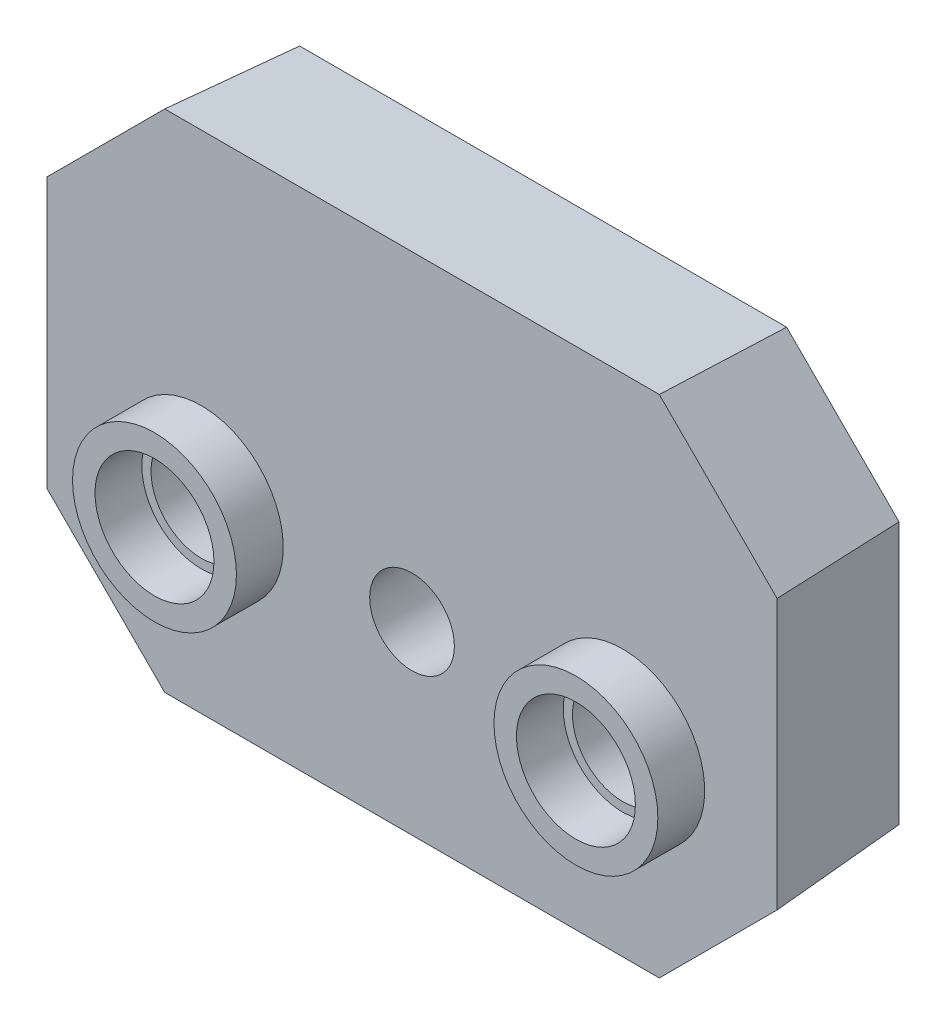
ISO-10303-21;
HEADER;
FILE_DESCRIPTION(('STEP AP214'),'2;1');
FILE_NAME('part.step','',(''),(''),'','','');
FILE_SCHEMA(('AUTOMOTIVE_DESIGN { 1 0 10303 214 1 1 1 1 }'));
ENDSEC;
DATA;
#1=APPLICATION_CONTEXT('core data for automotive mechanical design processes');
#2=APPLICATION_PROTOCOL_DEFINITION('international standard','automotive_design',2000,#1);
#3=PRODUCT_CONTEXT('',#1,'mechanical');
#4=PRODUCT('Part','Part','',(#3));
#5=PRODUCT_RELATED_PRODUCT_CATEGORY('part','',(#4));
#6=PRODUCT_DEFINITION_FORMATION('','',#4);
#7=PRODUCT_DEFINITION_CONTEXT('part definition',#1,'design');
#8=PRODUCT_DEFINITION('design','',#6,#7);
#9=PRODUCT_DEFINITION_SHAPE('','',#8);
#10=(LENGTH_UNIT() NAMED_UNIT(*) SI_UNIT(.MILLI.,.METRE.));
#11=(NAMED_UNIT(*) PLANE_ANGLE_UNIT() SI_UNIT($,.RADIAN.));
#12=(NAMED_UNIT(*) SI_UNIT($,.STERADIAN.) SOLID_ANGLE_UNIT());
#13=UNCERTAINTY_MEASURE_WITH_UNIT(LENGTH_MEASURE(1.E-05),#10,'distance_accuracy_value','');
#14=(GEOMETRIC_REPRESENTATION_CONTEXT(3) GLOBAL_UNCERTAINTY_ASSIGNED_CONTEXT((#13)) GLOBAL_UNIT_ASSIGNED_CONTEXT((#10,
#11,#12)) REPRESENTATION_CONTEXT('',''));
#15=CARTESIAN_POINT('',(0.,0.,0.));
#16=DIRECTION('',(0.,0.,1.));
#17=DIRECTION('',(1.,0.,0.));
#18=AXIS2_PLACEMENT_3D('',#15,#16,#17);
#19=CARTESIAN_POINT('',(0.,0.,28.));
#20=DIRECTION('',(0.,0.,-1.));
#21=DIRECTION('',(-1.,0.,0.));
#22=AXIS2_PLACEMENT_3D('',#19,#20,#21);
#23=PLANE('',#22);
#24=CARTESIAN_POINT('',(-45.,-14.5,28.));
#25=DIRECTION('',(0.,0.,-1.));
#26=DIRECTION('',(-1.,0.,0.));
#27=AXIS2_PLACEMENT_3D('',#24,#25,#26);
#28=CIRCLE('',#27,10.7420492655817);
#29=CARTESIAN_POINT('',(-55.7420492655817,-14.5,28.));
#30=VERTEX_POINT('',#29);
#31=EDGE_CURVE('E131',#30,#30,#28,.F.);
#32=ORIENTED_EDGE('',*,*,#31,.F.);
#33=EDGE_LOOP('',(#32));
#34=FACE_BOUND('',#33,.T.);
#35=CARTESIAN_POINT('',(-45.,-14.5,28.));
#36=DIRECTION('',(0.,0.,-1.));
#37=DIRECTION('',(-1.,0.,0.));
#38=AXIS2_PLACEMENT_3D('',#35,#36,#37);
#39=CIRCLE('',#38,12.7);
#40=CARTESIAN_POINT('',(-57.7,-14.5,28.));
#41=VERTEX_POINT('',#40);
#42=EDGE_CURVE('E244',#41,#41,#39,.F.);
#43=ORIENTED_EDGE('',*,*,#42,.T.);
#44=EDGE_LOOP('',(#43));
#45=FACE_BOUND('',#44,.T.);
#46=ADVANCED_FACE('F41',(#34,#45),#23,.F.);
#47=CARTESIAN_POINT('',(45.,-14.5,28.));
#48=DIRECTION('',(0.,0.,-1.));
#49=DIRECTION('',(-1.,0.,0.));
#50=AXIS2_PLACEMENT_3D('',#47,#48,#49);
#51=CIRCLE('',#50,10.7420492655817);
#52=CARTESIAN_POINT('',(34.2579507344183,-14.5,28.));
#53=VERTEX_POINT('',#52);
#54=EDGE_CURVE('E152',#53,#53,#51,.F.);
#55=ORIENTED_EDGE('',*,*,#54,.F.);
#56=EDGE_LOOP('',(#55));
#57=FACE_BOUND('',#56,.T.);
#58=CARTESIAN_POINT('',(45.,-14.5,28.));
#59=DIRECTION('',(0.,0.,-1.));
#60=DIRECTION('',(-1.,0.,0.));
#61=AXIS2_PLACEMENT_3D('',#58,#59,#60);
#62=CIRCLE('',#61,12.7);
#63=CARTESIAN_POINT('',(32.3,-14.5,28.));
#64=VERTEX_POINT('',#63);
#65=EDGE_CURVE('E375',#64,#64,#62,.F.);
#66=ORIENTED_EDGE('',*,*,#65,.T.);
#67=EDGE_LOOP('',(#66));
#68=FACE_BOUND('',#67,.T.);
#69=ADVANCED_FACE('F219',(#57,#68),#23,.F.);
#70=CARTESIAN_POINT('',(-45.,-14.5,28.));
#71=DIRECTION('',(0.,0.,-1.));
#72=DIRECTION('',(-1.,0.,0.));
#73=AXIS2_PLACEMENT_3D('',#70,#71,#72);
#74=CIRCLE('',#73,17.5);
#75=CARTESIAN_POINT('',(-62.5,-14.5,28.));
#76=VERTEX_POINT('',#75);
#77=EDGE_CURVE('E11',#76,#76,#74,.F.);
#78=ORIENTED_EDGE('',*,*,#77,.F.);
#79=EDGE_LOOP('',(#78));
#80=FACE_BOUND('',#79,.T.);
#81=CARTESIAN_POINT('',(45.,-14.5,28.));
#82=DIRECTION('',(0.,0.,-1.));
#83=DIRECTION('',(-1.,0.,0.));
#84=AXIS2_PLACEMENT_3D('',#81,#82,#83);
#85=CIRCLE('',#84,17.5);
#86=CARTESIAN_POINT('',(27.5,-14.5,28.));
#87=VERTEX_POINT('',#86);
#88=EDGE_CURVE('E49',#87,#87,#85,.F.);
#89=ORIENTED_EDGE('',*,*,#88,.F.);
#90=EDGE_LOOP('',(#89));
#91=FACE_BOUND('',#90,.T.);
#92=DIRECTION('',(0.707106781186548,0.707106781186548,0.));
#93=VECTOR('',#92,1.);
#94=CARTESIAN_POINT('',(-53.3844802415364,53.3844802415364,28.));
#95=LINE('',#94,#93);
#96=CARTESIAN_POINT('',(-52.8110097486544,53.9579507344183,28.));
#97=VERTEX_POINT('',#96);
#98=CARTESIAN_POINT('',(-77.9579507344183,28.8110097486544,28.));
#99=VERTEX_POINT('',#98);
#100=EDGE_CURVE('E148',#97,#99,#95,.F.);
#101=ORIENTED_EDGE('',*,*,#100,.T.);
#102=DIRECTION('',(0.,1.,0.));
#103=VECTOR('',#102,1.);
#104=CARTESIAN_POINT('',(-77.9579507344183,0.,28.));
#105=LINE('',#104,#103);
#106=CARTESIAN_POINT('',(-77.9579507344183,-28.8110097486544,28.));
#107=VERTEX_POINT('',#106);
#108=EDGE_CURVE('E121',#99,#107,#105,.F.);
#109=ORIENTED_EDGE('',*,*,#108,.T.);
#110=DIRECTION('',(-0.707106781186548,0.707106781186548,0.));
#111=VECTOR('',#110,1.);
#112=CARTESIAN_POINT('',(-53.3844802415364,-53.3844802415364,28.));
#113=LINE('',#112,#111);
#114=CARTESIAN_POINT('',(-52.8110097486544,-53.9579507344183,28.));
#115=VERTEX_POINT('',#114);
#116=EDGE_CURVE('E178',#107,#115,#113,.F.);
#117=ORIENTED_EDGE('',*,*,#116,.T.);
#118=DIRECTION('',(-1.,0.,0.));
#119=VECTOR('',#118,1.);
#120=CARTESIAN_POINT('',(0.,-53.9579507344183,28.));
#121=LINE('',#120,#119);
#122=CARTESIAN_POINT('',(52.8110097486544,-53.9579507344183,28.));
#123=VERTEX_POINT('',#122);
#124=EDGE_CURVE('E179',#115,#123,#121,.F.);
#125=ORIENTED_EDGE('',*,*,#124,.T.);
#126=DIRECTION('',(-0.707106781186548,-0.707106781186548,0.));
#127=VECTOR('',#126,1.);
#128=CARTESIAN_POINT('',(53.3844802415364,-53.3844802415364,28.));
#129=LINE('',#128,#127);
#130=CARTESIAN_POINT('',(77.9579507344183,-28.8110097486544,28.));
#131=VERTEX_POINT('',#130);
#132=EDGE_CURVE('E185',#123,#131,#129,.F.);
#133=ORIENTED_EDGE('',*,*,#132,.T.);
#134=DIRECTION('',(0.,-1.,0.));
#135=VECTOR('',#134,1.);
#136=CARTESIAN_POINT('',(77.9579507344183,0.,28.));
#137=LINE('',#136,#135);
#138=CARTESIAN_POINT('',(77.9579507344183,28.8110097486544,28.));
#139=VERTEX_POINT('',#138);
#140=EDGE_CURVE('E182',#131,#139,#137,.F.);
#141=ORIENTED_EDGE('',*,*,#140,.T.);
#142=DIRECTION('',(0.707106781186548,-0.707106781186548,0.));
#143=VECTOR('',#142,1.);
#144=CARTESIAN_POINT('',(53.3844802415364,53.3844802415364,28.));
#145=LINE('',#144,#143);
#146=CARTESIAN_POINT('',(52.8110097486544,53.9579507344183,28.));
#147=VERTEX_POINT('',#146);
#148=EDGE_CURVE('E65',#139,#147,#145,.F.);
#149=ORIENTED_EDGE('',*,*,#148,.T.);
#150=DIRECTION('',(1.,0.,0.));
#151=VECTOR('',#150,1.);
#152=CARTESIAN_POINT('',(0.,53.9579507344183,28.));
#153=LINE('',#152,#151);
#154=EDGE_CURVE('E44',#147,#97,#153,.F.);
#155=ORIENTED_EDGE('',*,*,#154,.T.);
#156=EDGE_LOOP('',(#101,#109,#117,#125,#133,#141,#149,#155));
#157=FACE_BOUND('',#156,.T.);
#158=CARTESIAN_POINT('',(0.,-14.5,28.));
#159=DIRECTION('',(0.,0.,-1.));
#160=DIRECTION('',(-1.,0.,0.));
#161=AXIS2_PLACEMENT_3D('',#158,#159,#160);
#162=CIRCLE('',#161,9.04204926558171);
#163=CARTESIAN_POINT('',(-9.04204926558171,-14.5,28.));
#164=VERTEX_POINT('',#163);
#165=EDGE_CURVE('E151',#164,#164,#162,.F.);
#166=ORIENTED_EDGE('',*,*,#165,.F.);
#167=EDGE_LOOP('',(#166));
#168=FACE_BOUND('',#167,.T.);
#169=ADVANCED_FACE('F190',(#80,#91,#157,#168),#23,.F.);
#170=CARTESIAN_POINT('',(0.,0.,0.));
#171=DIRECTION('',(0.,0.,-1.));
#172=DIRECTION('',(-1.,0.,0.));
#173=AXIS2_PLACEMENT_3D('',#170,#171,#172);
#174=PLANE('',#173);
#175=CARTESIAN_POINT('',(45.,-14.5,0.));
#176=DIRECTION('',(0.,0.,1.));
#177=DIRECTION('',(1.,0.,0.));
#178=AXIS2_PLACEMENT_3D('',#175,#176,#177);
#179=CIRCLE('',#178,12.7);
#180=CARTESIAN_POINT('',(57.7,-14.5,0.));
#181=VERTEX_POINT('',#180);
#182=EDGE_CURVE('E154',#181,#181,#179,.T.);
#183=ORIENTED_EDGE('',*,*,#182,.T.);
#184=EDGE_LOOP('',(#183));
#185=FACE_BOUND('',#184,.T.);
#186=DIRECTION('',(-0.707106781186548,-0.707106781186547,0.));
#187=VECTOR('',#186,1.);
#188=CARTESIAN_POINT('',(-76.,28.,0.));
#189=LINE('',#188,#187);
#190=CARTESIAN_POINT('',(-52.,52.,0.));
#191=VERTEX_POINT('',#190);
#192=CARTESIAN_POINT('',(-76.,28.,0.));
#193=VERTEX_POINT('',#192);
#194=EDGE_CURVE('E111',#191,#193,#189,.T.);
#195=ORIENTED_EDGE('',*,*,#194,.F.);
#196=DIRECTION('',(-1.,0.,0.));
#197=VECTOR('',#196,1.);
#198=CARTESIAN_POINT('',(-52.,52.,0.));
#199=LINE('',#198,#197);
#200=CARTESIAN_POINT('',(52.,52.,0.));
#201=VERTEX_POINT('',#200);
#202=EDGE_CURVE('E149',#201,#191,#199,.T.);
#203=ORIENTED_EDGE('',*,*,#202,.F.);
#204=DIRECTION('',(-0.707106781186548,0.707106781186547,0.));
#205=VECTOR('',#204,1.);
#206=CARTESIAN_POINT('',(52.,52.,0.));
#207=LINE('',#206,#205);
#208=CARTESIAN_POINT('',(76.,28.,0.));
#209=VERTEX_POINT('',#208);
#210=EDGE_CURVE('E147',#209,#201,#207,.T.);
#211=ORIENTED_EDGE('',*,*,#210,.F.);
#212=DIRECTION('',(0.,1.,0.));
#213=VECTOR('',#212,1.);
#214=CARTESIAN_POINT('',(76.,28.,0.));
#215=LINE('',#214,#213);
#216=CARTESIAN_POINT('',(76.,-28.,0.));
#217=VERTEX_POINT('',#216);
#218=EDGE_CURVE('E143',#217,#209,#215,.T.);
#219=ORIENTED_EDGE('',*,*,#218,.F.);
#220=DIRECTION('',(0.707106781186548,0.707106781186547,0.));
#221=VECTOR('',#220,1.);
#222=CARTESIAN_POINT('',(76.,-28.,0.));
#223=LINE('',#222,#221);
#224=CARTESIAN_POINT('',(52.,-52.,0.));
#225=VERTEX_POINT('',#224);
#226=EDGE_CURVE('E145',#225,#217,#223,.T.);
#227=ORIENTED_EDGE('',*,*,#226,.F.);
#228=DIRECTION('',(1.,0.,0.));
#229=VECTOR('',#228,1.);
#230=CARTESIAN_POINT('',(52.,-52.,0.));
#231=LINE('',#230,#229);
#232=CARTESIAN_POINT('',(-52.,-52.,0.));
#233=VERTEX_POINT('',#232);
#234=EDGE_CURVE('E139',#233,#225,#231,.T.);
#235=ORIENTED_EDGE('',*,*,#234,.F.);
#236=DIRECTION('',(0.707106781186548,-0.707106781186547,0.));
#237=VECTOR('',#236,1.);
#238=CARTESIAN_POINT('',(-52.,-52.,0.));
#239=LINE('',#238,#237);
#240=CARTESIAN_POINT('',(-76.,-28.,0.));
#241=VERTEX_POINT('',#240);
#242=EDGE_CURVE('E113',#241,#233,#239,.T.);
#243=ORIENTED_EDGE('',*,*,#242,.F.);
#244=DIRECTION('',(0.,-1.,0.));
#245=VECTOR('',#244,1.);
#246=CARTESIAN_POINT('',(-76.,-28.,0.));
#247=LINE('',#246,#245);
#248=EDGE_CURVE('E110',#193,#241,#247,.T.);
#249=ORIENTED_EDGE('',*,*,#248,.F.);
#250=EDGE_LOOP('',(#195,#203,#211,#219,#227,#235,#243,#249));
#251=FACE_BOUND('',#250,.T.);
#252=CARTESIAN_POINT('',(0.,-14.5,0.));
#253=DIRECTION('',(0.,0.,1.));
#254=DIRECTION('',(1.,0.,0.));
#255=AXIS2_PLACEMENT_3D('',#252,#253,#254);
#256=CIRCLE('',#255,11.);
#257=CARTESIAN_POINT('',(11.,-14.5,0.));
#258=VERTEX_POINT('',#257);
#259=EDGE_CURVE('E160',#258,#258,#256,.T.);
#260=ORIENTED_EDGE('',*,*,#259,.T.);
#261=EDGE_LOOP('',(#260));
#262=FACE_BOUND('',#261,.T.);
#263=CARTESIAN_POINT('',(-45.,-14.5,0.));
#264=DIRECTION('',(0.,0.,1.));
#265=DIRECTION('',(1.,0.,0.));
#266=AXIS2_PLACEMENT_3D('',#263,#264,#265);
#267=CIRCLE('',#266,12.7);
#268=CARTESIAN_POINT('',(-32.3,-14.5,0.));
#269=VERTEX_POINT('',#268);
#270=EDGE_CURVE('E132',#269,#269,#267,.T.);
#271=ORIENTED_EDGE('',*,*,#270,.T.);
#272=EDGE_LOOP('',(#271));
#273=FACE_BOUND('',#272,.T.);
#274=ADVANCED_FACE('F109',(#185,#251,#262,#273),#174,.T.);
#275=CARTESIAN_POINT('',(-76.,28.,0.));
#276=DIRECTION('',(-0.70538430460664,0.70538430460664,-0.0697564737441253));
#277=DIRECTION('',(0.0493252756161324,-0.0493252756161324,-0.997564050259824));
#278=AXIS2_PLACEMENT_3D('',#275,#276,#277);
#279=PLANE('',#278);
#280=ORIENTED_EDGE('',*,*,#194,.T.);
#281=DIRECTION('',(0.0697273732502733,-0.0288820236689142,-0.997147893809341));
#282=VECTOR('',#281,1.);
#283=CARTESIAN_POINT('',(-75.8872234119032,27.9532864076921,-1.61278034794292));
#284=LINE('',#283,#282);
#285=EDGE_CURVE('E123',#99,#193,#284,.T.);
#286=ORIENTED_EDGE('',*,*,#285,.F.);
#287=ORIENTED_EDGE('',*,*,#100,.F.);
#288=DIRECTION('',(0.0288820236689141,-0.0697273732502733,-0.997147893809341));
#289=VECTOR('',#288,1.);
#290=CARTESIAN_POINT('',(-51.971687287519,51.9316470655409,-0.977492503367005));
#291=LINE('',#290,#289);
#292=EDGE_CURVE('E127',#97,#191,#291,.T.);
#293=ORIENTED_EDGE('',*,*,#292,.T.);
#294=EDGE_LOOP('',(#280,#286,#287,#293));
#295=FACE_BOUND('',#294,.T.);
#296=ADVANCED_FACE('F129',(#295),#279,.T.);
#297=CARTESIAN_POINT('',(-76.,-28.,0.));
#298=DIRECTION('',(-0.997564050259824,0.,-0.0697564737441253));
#299=DIRECTION('',(0.0697564737441253,0.,-0.997564050259824));
#300=AXIS2_PLACEMENT_3D('',#297,#298,#299);
#301=PLANE('',#300);
#302=ORIENTED_EDGE('',*,*,#248,.T.);
#303=DIRECTION('',(0.0697273732502733,0.0288820236689142,-0.997147893809341));
#304=VECTOR('',#303,1.);
#305=CARTESIAN_POINT('',(-75.9316470655409,-27.971687287519,-0.977492503367005));
#306=LINE('',#305,#304);
#307=EDGE_CURVE('E128',#107,#241,#306,.T.);
#308=ORIENTED_EDGE('',*,*,#307,.F.);
#309=ORIENTED_EDGE('',*,*,#108,.F.);
#310=ORIENTED_EDGE('',*,*,#285,.T.);
#311=EDGE_LOOP('',(#302,#308,#309,#310));
#312=FACE_BOUND('',#311,.T.);
#313=ADVANCED_FACE('F122',(#312),#301,.T.);
#314=CARTESIAN_POINT('',(-52.,-52.,0.));
#315=DIRECTION('',(-0.70538430460664,-0.70538430460664,-0.0697564737441253));
#316=DIRECTION('',(0.0493252756161324,0.0493252756161324,-0.997564050259824));
#317=AXIS2_PLACEMENT_3D('',#314,#315,#316);
#318=PLANE('',#317);
#319=ORIENTED_EDGE('',*,*,#242,.T.);
#320=DIRECTION('',(0.0288820236689142,0.0697273732502733,-0.997147893809341));
#321=VECTOR('',#320,1.);
#322=CARTESIAN_POINT('',(-51.913246185714,-51.7905577649631,-2.99516350332257));
#323=LINE('',#322,#321);
#324=EDGE_CURVE('E175',#115,#233,#323,.T.);
#325=ORIENTED_EDGE('',*,*,#324,.F.);
#326=ORIENTED_EDGE('',*,*,#116,.F.);
#327=ORIENTED_EDGE('',*,*,#307,.T.);
#328=EDGE_LOOP('',(#319,#325,#326,#327));
#329=FACE_BOUND('',#328,.T.);
#330=ADVANCED_FACE('F205',(#329),#318,.T.);
#331=CARTESIAN_POINT('',(52.,-52.,0.));
#332=DIRECTION('',(0.,-0.997564050259824,-0.0697564737441253));
#333=DIRECTION('',(0.,0.0697564737441253,-0.997564050259824));
#334=AXIS2_PLACEMENT_3D('',#331,#332,#333);
#335=PLANE('',#334);
#336=ORIENTED_EDGE('',*,*,#234,.T.);
#337=DIRECTION('',(-0.0288820236689141,0.0697273732502733,-0.997147893809341));
#338=VECTOR('',#337,1.);
#339=CARTESIAN_POINT('',(51.971687287519,-51.9316470655409,-0.977492503367005));
#340=LINE('',#339,#338);
#341=EDGE_CURVE('E170',#123,#225,#340,.T.);
#342=ORIENTED_EDGE('',*,*,#341,.F.);
#343=ORIENTED_EDGE('',*,*,#124,.F.);
#344=ORIENTED_EDGE('',*,*,#324,.T.);
#345=EDGE_LOOP('',(#336,#342,#343,#344));
#346=FACE_BOUND('',#345,.T.);
#347=ADVANCED_FACE('F207',(#346),#335,.T.);
#348=CARTESIAN_POINT('',(76.,-28.,0.));
#349=DIRECTION('',(0.70538430460664,-0.70538430460664,-0.0697564737441253));
#350=DIRECTION('',(-0.0493252756161324,0.0493252756161324,-0.997564050259824));
#351=AXIS2_PLACEMENT_3D('',#348,#349,#350);
#352=PLANE('',#351);
#353=ORIENTED_EDGE('',*,*,#226,.T.);
#354=DIRECTION('',(-0.0697273732502733,0.0288820236689142,-0.997147893809341));
#355=VECTOR('',#354,1.);
#356=CARTESIAN_POINT('',(75.8872234119032,-27.9532864076921,-1.61278034794292));
#357=LINE('',#356,#355);
#358=EDGE_CURVE('E168',#131,#217,#357,.T.);
#359=ORIENTED_EDGE('',*,*,#358,.F.);
#360=ORIENTED_EDGE('',*,*,#132,.F.);
#361=ORIENTED_EDGE('',*,*,#341,.T.);
#362=EDGE_LOOP('',(#353,#359,#360,#361));
#363=FACE_BOUND('',#362,.T.);
#364=ADVANCED_FACE('F209',(#363),#352,.T.);
#365=CARTESIAN_POINT('',(76.,28.,0.));
#366=DIRECTION('',(0.997564050259824,0.,-0.0697564737441253));
#367=DIRECTION('',(-0.0697564737441253,0.,-0.997564050259824));
#368=AXIS2_PLACEMENT_3D('',#365,#366,#367);
#369=PLANE('',#368);
#370=ORIENTED_EDGE('',*,*,#218,.T.);
#371=DIRECTION('',(-0.0697273732502733,-0.0288820236689142,-0.997147893809341));
#372=VECTOR('',#371,1.);
#373=CARTESIAN_POINT('',(75.9316470655409,27.971687287519,-0.977492503367005));
#374=LINE('',#373,#372);
#375=EDGE_CURVE('E163',#139,#209,#374,.T.);
#376=ORIENTED_EDGE('',*,*,#375,.F.);
#377=ORIENTED_EDGE('',*,*,#140,.F.);
#378=ORIENTED_EDGE('',*,*,#358,.T.);
#379=EDGE_LOOP('',(#370,#376,#377,#378));
#380=FACE_BOUND('',#379,.T.);
#381=ADVANCED_FACE('F195',(#380),#369,.T.);
#382=CARTESIAN_POINT('',(52.,52.,0.));
#383=DIRECTION('',(0.70538430460664,0.70538430460664,-0.0697564737441253));
#384=DIRECTION('',(-0.0493252756161324,-0.0493252756161324,-0.997564050259824));
#385=AXIS2_PLACEMENT_3D('',#382,#383,#384);
#386=PLANE('',#385);
#387=ORIENTED_EDGE('',*,*,#210,.T.);
#388=DIRECTION('',(-0.0288820236689142,-0.0697273732502733,-0.997147893809341));
#389=VECTOR('',#388,1.);
#390=CARTESIAN_POINT('',(51.913246185714,51.7905577649631,-2.99516350332257));
#391=LINE('',#390,#389);
#392=EDGE_CURVE('E158',#147,#201,#391,.T.);
#393=ORIENTED_EDGE('',*,*,#392,.F.);
#394=ORIENTED_EDGE('',*,*,#148,.F.);
#395=ORIENTED_EDGE('',*,*,#375,.T.);
#396=EDGE_LOOP('',(#387,#393,#394,#395));
#397=FACE_BOUND('',#396,.T.);
#398=ADVANCED_FACE('F197',(#397),#386,.T.);
#399=CARTESIAN_POINT('',(-52.,52.,0.));
#400=DIRECTION('',(0.,0.997564050259824,-0.0697564737441253));
#401=DIRECTION('',(0.,-0.0697564737441253,-0.997564050259824));
#402=AXIS2_PLACEMENT_3D('',#399,#400,#401);
#403=PLANE('',#402);
#404=ORIENTED_EDGE('',*,*,#202,.T.);
#405=ORIENTED_EDGE('',*,*,#292,.F.);
#406=ORIENTED_EDGE('',*,*,#154,.F.);
#407=ORIENTED_EDGE('',*,*,#392,.T.);
#408=EDGE_LOOP('',(#404,#405,#406,#407));
#409=FACE_BOUND('',#408,.T.);
#410=ADVANCED_FACE('F198',(#409),#403,.T.);
#411=CARTESIAN_POINT('',(-45.,-14.5,0.));
#412=DIRECTION('',(0.,0.,-1.));
#413=DIRECTION('',(1.,0.,0.));
#414=AXIS2_PLACEMENT_3D('',#411,#412,#413);
#415=CONICAL_SURFACE('',#414,12.7,0.0698131700797732);
#416=ORIENTED_EDGE('',*,*,#31,.T.);
#417=EDGE_LOOP('',(#416));
#418=FACE_BOUND('',#417,.T.);
#419=ORIENTED_EDGE('',*,*,#270,.F.);
#420=EDGE_LOOP('',(#419));
#421=FACE_BOUND('',#420,.T.);
#422=ADVANCED_FACE('F253',(#418,#421),#415,.F.);
#423=CARTESIAN_POINT('',(45.,-14.5,0.));
#424=DIRECTION('',(0.,0.,-1.));
#425=DIRECTION('',(1.,0.,0.));
#426=AXIS2_PLACEMENT_3D('',#423,#424,#425);
#427=CONICAL_SURFACE('',#426,12.7,0.0698131700797732);
#428=ORIENTED_EDGE('',*,*,#54,.T.);
#429=EDGE_LOOP('',(#428));
#430=FACE_BOUND('',#429,.T.);
#431=ORIENTED_EDGE('',*,*,#182,.F.);
#432=EDGE_LOOP('',(#431));
#433=FACE_BOUND('',#432,.T.);
#434=ADVANCED_FACE('F252',(#430,#433),#427,.F.);
#435=CARTESIAN_POINT('',(0.,-14.5,0.));
#436=DIRECTION('',(0.,0.,-1.));
#437=DIRECTION('',(1.,0.,0.));
#438=AXIS2_PLACEMENT_3D('',#435,#436,#437);
#439=CONICAL_SURFACE('',#438,11.,0.0698131700797732);
#440=ORIENTED_EDGE('',*,*,#165,.T.);
#441=EDGE_LOOP('',(#440));
#442=FACE_BOUND('',#441,.T.);
#443=ORIENTED_EDGE('',*,*,#259,.F.);
#444=EDGE_LOOP('',(#443));
#445=FACE_BOUND('',#444,.T.);
#446=ADVANCED_FACE('F43',(#442,#445),#439,.F.);
#447=CARTESIAN_POINT('',(45.,-14.5,38.));
#448=DIRECTION('',(0.,0.,-1.));
#449=DIRECTION('',(-1.,0.,0.));
#450=AXIS2_PLACEMENT_3D('',#447,#448,#449);
#451=CYLINDRICAL_SURFACE('',#450,17.5);
#452=CARTESIAN_POINT('',(45.,-14.5,38.));
#453=DIRECTION('',(0.,0.,1.));
#454=DIRECTION('',(1.,0.,0.));
#455=AXIS2_PLACEMENT_3D('',#452,#453,#454);
#456=CIRCLE('',#455,17.5);
#457=CARTESIAN_POINT('',(62.5,-14.5,38.));
#458=VERTEX_POINT('',#457);
#459=EDGE_CURVE('E373',#458,#458,#456,.T.);
#460=ORIENTED_EDGE('',*,*,#459,.F.);
#461=EDGE_LOOP('',(#460));
#462=FACE_BOUND('',#461,.T.);
#463=ORIENTED_EDGE('',*,*,#88,.T.);
#464=EDGE_LOOP('',(#463));
#465=FACE_BOUND('',#464,.T.);
#466=ADVANCED_FACE('F260',(#462,#465),#451,.T.);
#467=CARTESIAN_POINT('',(45.,-14.5,38.));
#468=DIRECTION('',(0.,0.,-1.));
#469=DIRECTION('',(-1.,0.,0.));
#470=AXIS2_PLACEMENT_3D('',#467,#468,#469);
#471=CYLINDRICAL_SURFACE('',#470,12.7);
#472=CARTESIAN_POINT('',(45.,-14.5,38.));
#473=DIRECTION('',(0.,0.,1.));
#474=DIRECTION('',(1.,0.,0.));
#475=AXIS2_PLACEMENT_3D('',#472,#473,#474);
#476=CIRCLE('',#475,12.7);
#477=CARTESIAN_POINT('',(57.7,-14.5,38.));
#478=VERTEX_POINT('',#477);
#479=EDGE_CURVE('E369',#478,#478,#476,.T.);
#480=ORIENTED_EDGE('',*,*,#479,.T.);
#481=EDGE_LOOP('',(#480));
#482=FACE_BOUND('',#481,.T.);
#483=ORIENTED_EDGE('',*,*,#65,.F.);
#484=EDGE_LOOP('',(#483));
#485=FACE_BOUND('',#484,.T.);
#486=ADVANCED_FACE('F311',(#482,#485),#471,.F.);
#487=CARTESIAN_POINT('',(45.,-14.5,38.));
#488=DIRECTION('',(0.,0.,1.));
#489=DIRECTION('',(1.,0.,0.));
#490=AXIS2_PLACEMENT_3D('',#487,#488,#489);
#491=PLANE('',#490);
#492=ORIENTED_EDGE('',*,*,#459,.T.);
#493=EDGE_LOOP('',(#492));
#494=FACE_BOUND('',#493,.T.);
#495=ORIENTED_EDGE('',*,*,#479,.F.);
#496=EDGE_LOOP('',(#495));
#497=FACE_BOUND('',#496,.T.);
#498=ADVANCED_FACE('F321',(#494,#497),#491,.T.);
#499=CARTESIAN_POINT('',(-45.,-14.5,38.));
#500=DIRECTION('',(0.,0.,-1.));
#501=DIRECTION('',(-1.,0.,0.));
#502=AXIS2_PLACEMENT_3D('',#499,#500,#501);
#503=CYLINDRICAL_SURFACE('',#502,17.5);
#504=CARTESIAN_POINT('',(-45.,-14.5,38.));
#505=DIRECTION('',(0.,0.,1.));
#506=DIRECTION('',(1.,0.,0.));
#507=AXIS2_PLACEMENT_3D('',#504,#505,#506);
#508=CIRCLE('',#507,17.5);
#509=CARTESIAN_POINT('',(-27.5,-14.5,38.));
#510=VERTEX_POINT('',#509);
#511=EDGE_CURVE('E366',#510,#510,#508,.T.);
#512=ORIENTED_EDGE('',*,*,#511,.F.);
#513=EDGE_LOOP('',(#512));
#514=FACE_BOUND('',#513,.T.);
#515=ORIENTED_EDGE('',*,*,#77,.T.);
#516=EDGE_LOOP('',(#515));
#517=FACE_BOUND('',#516,.T.);
#518=ADVANCED_FACE('F328',(#514,#517),#503,.T.);
#519=CARTESIAN_POINT('',(-45.,-14.5,38.));
#520=DIRECTION('',(0.,0.,-1.));
#521=DIRECTION('',(-1.,0.,0.));
#522=AXIS2_PLACEMENT_3D('',#519,#520,#521);
#523=CYLINDRICAL_SURFACE('',#522,12.7);
#524=CARTESIAN_POINT('',(-45.,-14.5,38.));
#525=DIRECTION('',(0.,0.,1.));
#526=DIRECTION('',(1.,0.,0.));
#527=AXIS2_PLACEMENT_3D('',#524,#525,#526);
#528=CIRCLE('',#527,12.7);
#529=CARTESIAN_POINT('',(-32.3,-14.5,38.));
#530=VERTEX_POINT('',#529);
#531=EDGE_CURVE('E368',#530,#530,#528,.T.);
#532=ORIENTED_EDGE('',*,*,#531,.T.);
#533=EDGE_LOOP('',(#532));
#534=FACE_BOUND('',#533,.T.);
#535=ORIENTED_EDGE('',*,*,#42,.F.);
#536=EDGE_LOOP('',(#535));
#537=FACE_BOUND('',#536,.T.);
#538=ADVANCED_FACE('F338',(#534,#537),#523,.F.);
#539=CARTESIAN_POINT('',(-45.,-14.5,38.));
#540=DIRECTION('',(0.,0.,1.));
#541=DIRECTION('',(1.,0.,0.));
#542=AXIS2_PLACEMENT_3D('',#539,#540,#541);
#543=PLANE('',#542);
#544=ORIENTED_EDGE('',*,*,#511,.T.);
#545=EDGE_LOOP('',(#544));
#546=FACE_BOUND('',#545,.T.);
#547=ORIENTED_EDGE('',*,*,#531,.F.);
#548=EDGE_LOOP('',(#547));
#549=FACE_BOUND('',#548,.T.);
#550=ADVANCED_FACE('F349',(#546,#549),#543,.T.);
#551=CLOSED_SHELL('',(#46,#69,#169,#274,#296,#313,#330,#347,#364,#381,#398,#410,#422,#434,#446,
#466,#486,#498,#518,#538,#550));
#552=MANIFOLD_SOLID_BREP('B2',#551);
#553=ADVANCED_BREP_SHAPE_REPRESENTATION('',(#18,#552),#14);
#554=SHAPE_DEFINITION_REPRESENTATION(#9,#553);
ENDSEC;
END-ISO-10303-21;
